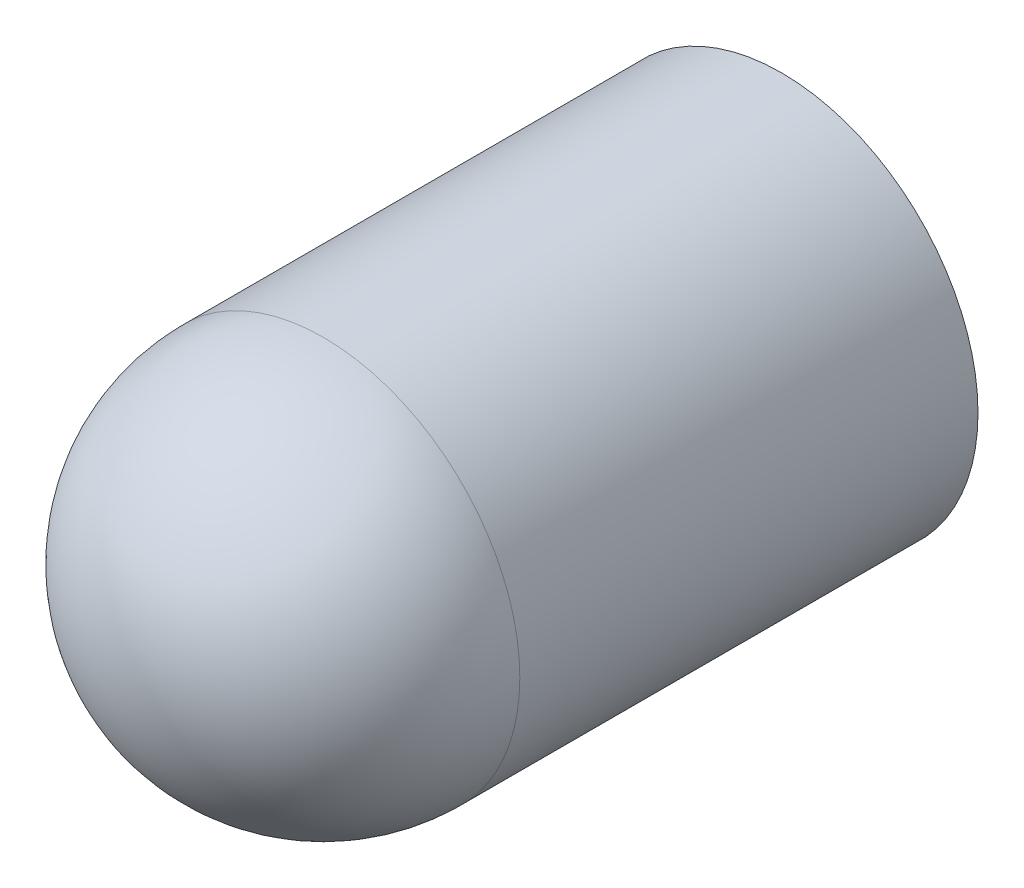
ISO-10303-21;
HEADER;
FILE_DESCRIPTION(('STEP AP214'),'2;1');
FILE_NAME('part.step','',(''),(''),'','','');
FILE_SCHEMA(('AUTOMOTIVE_DESIGN { 1 0 10303 214 1 1 1 1 }'));
ENDSEC;
DATA;
#1=APPLICATION_CONTEXT('core data for automotive mechanical design processes');
#2=APPLICATION_PROTOCOL_DEFINITION('international standard','automotive_design',2000,#1);
#3=PRODUCT_CONTEXT('',#1,'mechanical');
#4=PRODUCT('Part','Part','',(#3));
#5=PRODUCT_RELATED_PRODUCT_CATEGORY('part','',(#4));
#6=PRODUCT_DEFINITION_FORMATION('','',#4);
#7=PRODUCT_DEFINITION_CONTEXT('part definition',#1,'design');
#8=PRODUCT_DEFINITION('design','',#6,#7);
#9=PRODUCT_DEFINITION_SHAPE('','',#8);
#10=(LENGTH_UNIT() NAMED_UNIT(*) SI_UNIT(.MILLI.,.METRE.));
#11=(NAMED_UNIT(*) PLANE_ANGLE_UNIT() SI_UNIT($,.RADIAN.));
#12=(NAMED_UNIT(*) SI_UNIT($,.STERADIAN.) SOLID_ANGLE_UNIT());
#13=UNCERTAINTY_MEASURE_WITH_UNIT(LENGTH_MEASURE(1.E-05),#10,'distance_accuracy_value','');
#14=(GEOMETRIC_REPRESENTATION_CONTEXT(3) GLOBAL_UNCERTAINTY_ASSIGNED_CONTEXT((#13)) GLOBAL_UNIT_ASSIGNED_CONTEXT((#10,
#11,#12)) REPRESENTATION_CONTEXT('',''));
#15=CARTESIAN_POINT('',(0.,0.,0.));
#16=DIRECTION('',(0.,0.,1.));
#17=DIRECTION('',(1.,0.,0.));
#18=AXIS2_PLACEMENT_3D('',#15,#16,#17);
#19=CARTESIAN_POINT('',(5.73553390593279,-24.3761157692788,-2.));
#20=DIRECTION('',(0.,0.,1.));
#21=DIRECTION('',(1.,0.,0.));
#22=AXIS2_PLACEMENT_3D('',#19,#20,#21);
#23=CYLINDRICAL_SURFACE('',#22,1.5);
#24=CARTESIAN_POINT('',(5.73553390593279,-24.3761157692788,-2.));
#25=DIRECTION('',(0.,0.,1.));
#26=DIRECTION('',(1.,0.,0.));
#27=AXIS2_PLACEMENT_3D('',#24,#25,#26);
#28=CIRCLE('',#27,1.5);
#29=CARTESIAN_POINT('',(7.23553390593279,-24.3761157692788,-2.));
#30=VERTEX_POINT('',#29);
#31=EDGE_CURVE('E10',#30,#30,#28,.T.);
#32=ORIENTED_EDGE('',*,*,#31,.T.);
#33=EDGE_LOOP('',(#32));
#34=FACE_BOUND('',#33,.T.);
#35=CARTESIAN_POINT('',(5.73553390593279,-24.3761157692788,1.5));
#36=DIRECTION('',(0.,0.,1.));
#37=DIRECTION('',(1.,0.,0.));
#38=AXIS2_PLACEMENT_3D('',#35,#36,#37);
#39=CIRCLE('',#38,1.5);
#40=CARTESIAN_POINT('',(7.23553390593279,-24.3761157692788,1.5));
#41=VERTEX_POINT('',#40);
#42=EDGE_CURVE('E36',#41,#41,#39,.T.);
#43=ORIENTED_EDGE('',*,*,#42,.F.);
#44=EDGE_LOOP('',(#43));
#45=FACE_BOUND('',#44,.T.);
#46=ADVANCED_FACE('F30',(#34,#45),#23,.T.);
#47=CARTESIAN_POINT('',(5.73553390593279,-24.3761157692788,-2.));
#48=DIRECTION('',(0.,0.,1.));
#49=DIRECTION('',(1.,0.,0.));
#50=AXIS2_PLACEMENT_3D('',#47,#48,#49);
#51=PLANE('',#50);
#52=ORIENTED_EDGE('',*,*,#31,.F.);
#53=EDGE_LOOP('',(#52));
#54=FACE_BOUND('',#53,.T.);
#55=ADVANCED_FACE('F45',(#54),#51,.F.);
#56=CARTESIAN_POINT('',(5.73553390593279,-24.3761157692788,1.5));
#57=DIRECTION('',(0.,-1.,0.));
#58=DIRECTION('',(-1.,0.,0.));
#59=AXIS2_PLACEMENT_3D('',#56,#57,#58);
#60=SPHERICAL_SURFACE('',#59,1.5);
#61=CARTESIAN_POINT('',(5.73553390593279,-24.3761157692788,1.5));
#62=DIRECTION('',(0.,0.,1.));
#63=DIRECTION('',(1.,0.,0.));
#64=AXIS2_PLACEMENT_3D('',#61,#62,#63);
#65=SPHERICAL_SURFACE('',#64,1.5);
#66=ORIENTED_EDGE('',*,*,#42,.T.);
#67=EDGE_LOOP('',(#66));
#68=FACE_BOUND('',#67,.T.);
#69=ADVANCED_FACE('F42',(#68),#65,.T.);
#70=CLOSED_SHELL('',(#46,#55,#69));
#71=MANIFOLD_SOLID_BREP('B2',#70);
#72=ADVANCED_BREP_SHAPE_REPRESENTATION('',(#18,#71),#14);
#73=SHAPE_DEFINITION_REPRESENTATION(#9,#72);
ENDSEC;
END-ISO-10303-21;
